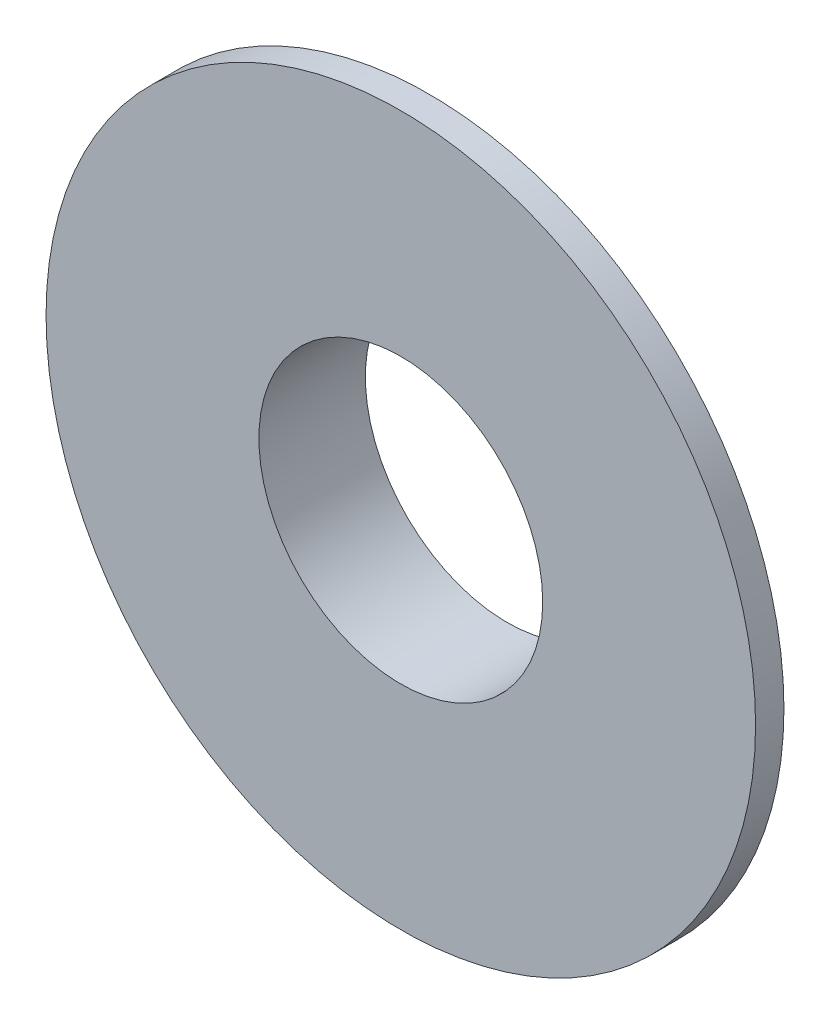
ISO-10303-21;
HEADER;
FILE_DESCRIPTION(('STEP AP214'),'2;1');
FILE_NAME('part.step','',(''),(''),'','','');
FILE_SCHEMA(('AUTOMOTIVE_DESIGN { 1 0 10303 214 1 1 1 1 }'));
ENDSEC;
DATA;
#1=APPLICATION_CONTEXT('core data for automotive mechanical design processes');
#2=APPLICATION_PROTOCOL_DEFINITION('international standard','automotive_design',2000,#1);
#3=PRODUCT_CONTEXT('',#1,'mechanical');
#4=PRODUCT('Part','Part','',(#3));
#5=PRODUCT_RELATED_PRODUCT_CATEGORY('part','',(#4));
#6=PRODUCT_DEFINITION_FORMATION('','',#4);
#7=PRODUCT_DEFINITION_CONTEXT('part definition',#1,'design');
#8=PRODUCT_DEFINITION('design','',#6,#7);
#9=PRODUCT_DEFINITION_SHAPE('','',#8);
#10=(LENGTH_UNIT() NAMED_UNIT(*) SI_UNIT(.MILLI.,.METRE.));
#11=(NAMED_UNIT(*) PLANE_ANGLE_UNIT() SI_UNIT($,.RADIAN.));
#12=(NAMED_UNIT(*) SI_UNIT($,.STERADIAN.) SOLID_ANGLE_UNIT());
#13=UNCERTAINTY_MEASURE_WITH_UNIT(LENGTH_MEASURE(1.E-05),#10,'distance_accuracy_value','');
#14=(GEOMETRIC_REPRESENTATION_CONTEXT(3) GLOBAL_UNCERTAINTY_ASSIGNED_CONTEXT((#13)) GLOBAL_UNIT_ASSIGNED_CONTEXT((#10,
#11,#12)) REPRESENTATION_CONTEXT('',''));
#15=CARTESIAN_POINT('',(0.,0.,0.));
#16=DIRECTION('',(0.,0.,1.));
#17=DIRECTION('',(1.,0.,0.));
#18=AXIS2_PLACEMENT_3D('',#15,#16,#17);
#19=CARTESIAN_POINT('',(0.,0.,-2.02254149635816));
#20=DIRECTION('',(0.,0.,1.));
#21=DIRECTION('',(1.,0.,0.));
#22=AXIS2_PLACEMENT_3D('',#19,#20,#21);
#23=TOROIDAL_SURFACE('',#22,7.5,1.);
#24=CARTESIAN_POINT('',(0.,0.,-1.02634679826641));
#25=DIRECTION('',(0.,0.,1.));
#26=DIRECTION('',(1.,0.,0.));
#27=AXIS2_PLACEMENT_3D('',#24,#25,#26);
#28=CIRCLE('',#27,7.41284425725235);
#29=CARTESIAN_POINT('',(7.41284425725235,0.,-1.02634679826641));
#30=VERTEX_POINT('',#29);
#31=EDGE_CURVE('E68',#30,#30,#28,.T.);
#32=ORIENTED_EDGE('',*,*,#31,.F.);
#33=EDGE_LOOP('',(#32));
#34=FACE_BOUND('',#33,.T.);
#35=CARTESIAN_POINT('',(0.,0.,-2.02254149635816));
#36=DIRECTION('',(0.,0.,1.));
#37=DIRECTION('',(1.,0.,0.));
#38=AXIS2_PLACEMENT_3D('',#35,#36,#37);
#39=CIRCLE('',#38,6.5);
#40=CARTESIAN_POINT('',(6.5,0.,-2.02254149635816));
#41=VERTEX_POINT('',#40);
#42=EDGE_CURVE('E10',#41,#41,#39,.T.);
#43=ORIENTED_EDGE('',*,*,#42,.T.);
#44=EDGE_LOOP('',(#43));
#45=FACE_BOUND('',#44,.T.);
#46=ADVANCED_FACE('F43',(#34,#45),#23,.F.);
#47=CARTESIAN_POINT('',(0.,0.,0.));
#48=DIRECTION('',(0.,0.,1.));
#49=DIRECTION('',(1.,0.,0.));
#50=AXIS2_PLACEMENT_3D('',#47,#48,#49);
#51=CYLINDRICAL_SURFACE('',#50,6.5);
#52=ORIENTED_EDGE('',*,*,#42,.F.);
#53=EDGE_LOOP('',(#52));
#54=FACE_BOUND('',#53,.T.);
#55=CARTESIAN_POINT('',(0.,0.,-3.));
#56=DIRECTION('',(0.,0.,1.));
#57=DIRECTION('',(1.,0.,0.));
#58=AXIS2_PLACEMENT_3D('',#55,#56,#57);
#59=CIRCLE('',#58,6.5);
#60=CARTESIAN_POINT('',(6.5,0.,-3.));
#61=VERTEX_POINT('',#60);
#62=EDGE_CURVE('E49',#61,#61,#59,.T.);
#63=ORIENTED_EDGE('',*,*,#62,.T.);
#64=EDGE_LOOP('',(#63));
#65=FACE_BOUND('',#64,.T.);
#66=ADVANCED_FACE('F75',(#54,#65),#51,.T.);
#67=CARTESIAN_POINT('',(-4.,0.,-3.));
#68=DIRECTION('',(0.,0.,1.));
#69=DIRECTION('',(1.,0.,0.));
#70=AXIS2_PLACEMENT_3D('',#67,#68,#69);
#71=PLANE('',#70);
#72=ORIENTED_EDGE('',*,*,#62,.F.);
#73=EDGE_LOOP('',(#72));
#74=FACE_BOUND('',#73,.T.);
#75=CARTESIAN_POINT('',(0.,0.,-3.));
#76=DIRECTION('',(0.,0.,1.));
#77=DIRECTION('',(1.,0.,0.));
#78=AXIS2_PLACEMENT_3D('',#75,#76,#77);
#79=CIRCLE('',#78,4.);
#80=CARTESIAN_POINT('',(4.,0.,-3.));
#81=VERTEX_POINT('',#80);
#82=EDGE_CURVE('E53',#81,#81,#79,.T.);
#83=ORIENTED_EDGE('',*,*,#82,.T.);
#84=EDGE_LOOP('',(#83));
#85=FACE_BOUND('',#84,.T.);
#86=ADVANCED_FACE('F79',(#74,#85),#71,.F.);
#87=CARTESIAN_POINT('',(0.,0.,0.));
#88=DIRECTION('',(0.,0.,1.));
#89=DIRECTION('',(1.,0.,0.));
#90=AXIS2_PLACEMENT_3D('',#87,#88,#89);
#91=CYLINDRICAL_SURFACE('',#90,4.);
#92=ORIENTED_EDGE('',*,*,#82,.F.);
#93=EDGE_LOOP('',(#92));
#94=FACE_BOUND('',#93,.T.);
#95=CARTESIAN_POINT('',(0.,0.,0.));
#96=DIRECTION('',(0.,0.,1.));
#97=DIRECTION('',(1.,0.,0.));
#98=AXIS2_PLACEMENT_3D('',#95,#96,#97);
#99=CIRCLE('',#98,4.);
#100=CARTESIAN_POINT('',(4.,0.,0.));
#101=VERTEX_POINT('',#100);
#102=EDGE_CURVE('E57',#101,#101,#99,.T.);
#103=ORIENTED_EDGE('',*,*,#102,.T.);
#104=EDGE_LOOP('',(#103));
#105=FACE_BOUND('',#104,.T.);
#106=ADVANCED_FACE('F84',(#94,#105),#91,.F.);
#107=CARTESIAN_POINT('',(-4.,0.,0.));
#108=DIRECTION('',(0.,0.,-1.));
#109=DIRECTION('',(-1.,0.,0.));
#110=AXIS2_PLACEMENT_3D('',#107,#108,#109);
#111=PLANE('',#110);
#112=ORIENTED_EDGE('',*,*,#102,.F.);
#113=EDGE_LOOP('',(#112));
#114=FACE_BOUND('',#113,.T.);
#115=CARTESIAN_POINT('',(0.,0.,0.));
#116=DIRECTION('',(0.,0.,1.));
#117=DIRECTION('',(1.,0.,0.));
#118=AXIS2_PLACEMENT_3D('',#115,#116,#117);
#119=CIRCLE('',#118,10.);
#120=CARTESIAN_POINT('',(10.,0.,0.));
#121=VERTEX_POINT('',#120);
#122=EDGE_CURVE('E62',#121,#121,#119,.T.);
#123=ORIENTED_EDGE('',*,*,#122,.T.);
#124=EDGE_LOOP('',(#123));
#125=FACE_BOUND('',#124,.T.);
#126=ADVANCED_FACE('F90',(#114,#125),#111,.F.);
#127=CARTESIAN_POINT('',(0.,0.,0.));
#128=DIRECTION('',(0.,0.,1.));
#129=DIRECTION('',(1.,0.,0.));
#130=AXIS2_PLACEMENT_3D('',#127,#128,#129);
#131=CYLINDRICAL_SURFACE('',#130,10.);
#132=ORIENTED_EDGE('',*,*,#122,.F.);
#133=EDGE_LOOP('',(#132));
#134=FACE_BOUND('',#133,.T.);
#135=CARTESIAN_POINT('',(0.,0.,-0.8));
#136=DIRECTION('',(0.,0.,1.));
#137=DIRECTION('',(1.,0.,0.));
#138=AXIS2_PLACEMENT_3D('',#135,#136,#137);
#139=CIRCLE('',#138,10.);
#140=CARTESIAN_POINT('',(10.,0.,-0.8));
#141=VERTEX_POINT('',#140);
#142=EDGE_CURVE('E65',#141,#141,#139,.T.);
#143=ORIENTED_EDGE('',*,*,#142,.T.);
#144=EDGE_LOOP('',(#143));
#145=FACE_BOUND('',#144,.T.);
#146=ADVANCED_FACE('F94',(#134,#145),#131,.T.);
#147=CARTESIAN_POINT('',(0.,0.,-1.02634679826641));
#148=DIRECTION('',(0.,0.,1.));
#149=DIRECTION('',(1.,0.,0.));
#150=AXIS2_PLACEMENT_3D('',#147,#148,#149);
#151=CONICAL_SURFACE('',#150,7.41284425725235,1.48352986419518);
#152=ORIENTED_EDGE('',*,*,#142,.F.);
#153=EDGE_LOOP('',(#152));
#154=FACE_BOUND('',#153,.T.);
#155=ORIENTED_EDGE('',*,*,#31,.T.);
#156=EDGE_LOOP('',(#155));
#157=FACE_BOUND('',#156,.T.);
#158=ADVANCED_FACE('F72',(#154,#157),#151,.T.);
#159=CLOSED_SHELL('',(#46,#66,#86,#106,#126,#146,#158));
#160=MANIFOLD_SOLID_BREP('B2',#159);
#161=ADVANCED_BREP_SHAPE_REPRESENTATION('',(#18,#160),#14);
#162=SHAPE_DEFINITION_REPRESENTATION(#9,#161);
ENDSEC;
END-ISO-10303-21;
